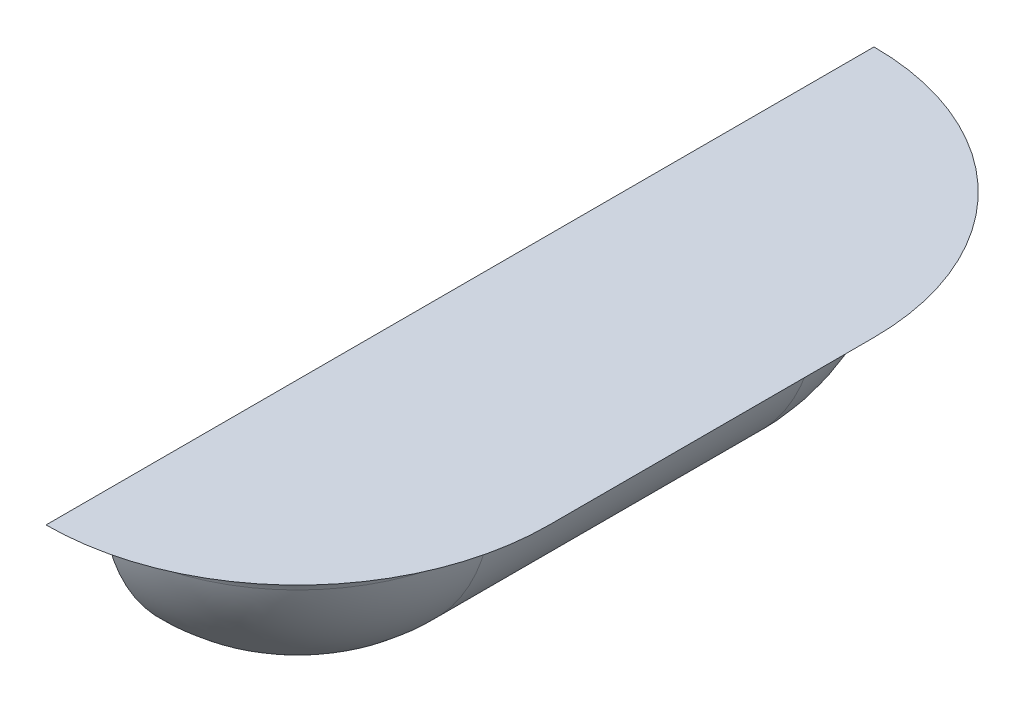
ISO-10303-21;
HEADER;
FILE_DESCRIPTION(('STEP AP214'),'2;1');
FILE_NAME('part.step','',(''),(''),'','','');
FILE_SCHEMA(('AUTOMOTIVE_DESIGN { 1 0 10303 214 1 1 1 1 }'));
ENDSEC;
DATA;
#1=APPLICATION_CONTEXT('core data for automotive mechanical design processes');
#2=APPLICATION_PROTOCOL_DEFINITION('international standard','automotive_design',2000,#1);
#3=PRODUCT_CONTEXT('',#1,'mechanical');
#4=PRODUCT('Part','Part','',(#3));
#5=PRODUCT_RELATED_PRODUCT_CATEGORY('part','',(#4));
#6=PRODUCT_DEFINITION_FORMATION('','',#4);
#7=PRODUCT_DEFINITION_CONTEXT('part definition',#1,'design');
#8=PRODUCT_DEFINITION('design','',#6,#7);
#9=PRODUCT_DEFINITION_SHAPE('','',#8);
#10=(LENGTH_UNIT() NAMED_UNIT(*) SI_UNIT(.MILLI.,.METRE.));
#11=(NAMED_UNIT(*) PLANE_ANGLE_UNIT() SI_UNIT($,.RADIAN.));
#12=(NAMED_UNIT(*) SI_UNIT($,.STERADIAN.) SOLID_ANGLE_UNIT());
#13=UNCERTAINTY_MEASURE_WITH_UNIT(LENGTH_MEASURE(1.E-05),#10,'distance_accuracy_value','');
#14=(GEOMETRIC_REPRESENTATION_CONTEXT(3) GLOBAL_UNCERTAINTY_ASSIGNED_CONTEXT((#13)) GLOBAL_UNIT_ASSIGNED_CONTEXT((#10,
#11,#12)) REPRESENTATION_CONTEXT('',''));
#15=CARTESIAN_POINT('',(0.,0.,0.));
#16=DIRECTION('',(0.,0.,1.));
#17=DIRECTION('',(1.,0.,0.));
#18=AXIS2_PLACEMENT_3D('',#15,#16,#17);
#19=CARTESIAN_POINT('',(-3.,0.,5.));
#20=DIRECTION('',(1.,0.,0.));
#21=DIRECTION('',(0.,0.,-1.));
#22=AXIS2_PLACEMENT_3D('',#19,#20,#21);
#23=PLANE('',#22);
#24=DIRECTION('',(0.,0.,-1.));
#25=VECTOR('',#24,1.);
#26=CARTESIAN_POINT('',(-3.,0.,5.));
#27=LINE('',#26,#25);
#28=CARTESIAN_POINT('',(-3.,0.,12.7459666924148));
#29=VERTEX_POINT('',#28);
#30=CARTESIAN_POINT('',(-3.,0.,-12.7459666924148));
#31=VERTEX_POINT('',#30);
#32=EDGE_CURVE('E90',#29,#31,#27,.T.);
#33=ORIENTED_EDGE('',*,*,#32,.T.);
#34=CARTESIAN_POINT('',(-3.,-2.,-12.7459666924148));
#35=DIRECTION('',(1.,0.,0.));
#36=DIRECTION('',(0.,0.,-1.));
#37=AXIS2_PLACEMENT_3D('',#34,#35,#36);
#38=CIRCLE('',#37,2.);
#39=CARTESIAN_POINT('',(-3.00000000000002,-1.5,-10.8094750193111));
#40=VERTEX_POINT('',#39);
#41=EDGE_CURVE('E11',#31,#40,#38,.T.);
#42=ORIENTED_EDGE('',*,*,#41,.T.);
#43=CARTESIAN_POINT('',(-3.,0.,-5.));
#44=DIRECTION('',(-1.,0.,0.));
#45=DIRECTION('',(0.,0.,1.));
#46=AXIS2_PLACEMENT_3D('',#43,#44,#45);
#47=CIRCLE('',#46,6.);
#48=CARTESIAN_POINT('',(-3.,-6.,-5.));
#49=VERTEX_POINT('',#48);
#50=EDGE_CURVE('E123',#40,#49,#47,.T.);
#51=ORIENTED_EDGE('',*,*,#50,.T.);
#52=DIRECTION('',(0.,0.,-1.));
#53=VECTOR('',#52,1.);
#54=CARTESIAN_POINT('',(-3.,-6.,5.));
#55=LINE('',#54,#53);
#56=CARTESIAN_POINT('',(-3.,-6.,5.));
#57=VERTEX_POINT('',#56);
#58=EDGE_CURVE('E119',#57,#49,#55,.T.);
#59=ORIENTED_EDGE('',*,*,#58,.F.);
#60=CARTESIAN_POINT('',(-3.,0.,5.));
#61=DIRECTION('',(-1.,0.,0.));
#62=DIRECTION('',(0.,0.,1.));
#63=AXIS2_PLACEMENT_3D('',#60,#61,#62);
#64=CIRCLE('',#63,6.);
#65=CARTESIAN_POINT('',(-3.00000000000002,-1.5,10.8094750193111));
#66=VERTEX_POINT('',#65);
#67=EDGE_CURVE('E117',#57,#66,#64,.T.);
#68=ORIENTED_EDGE('',*,*,#67,.T.);
#69=CARTESIAN_POINT('',(-3.,-2.,12.7459666924148));
#70=DIRECTION('',(1.,0.,0.));
#71=DIRECTION('',(0.,0.,-1.));
#72=AXIS2_PLACEMENT_3D('',#69,#70,#71);
#73=CIRCLE('',#72,2.);
#74=EDGE_CURVE('E45',#66,#29,#73,.T.);
#75=ORIENTED_EDGE('',*,*,#74,.T.);
#76=EDGE_LOOP('',(#33,#42,#51,#59,#68,#75));
#77=FACE_BOUND('',#76,.T.);
#78=ADVANCED_FACE('F36',(#77),#23,.F.);
#79=CARTESIAN_POINT('',(-3.,0.,5.));
#80=DIRECTION('',(0.,0.,-1.));
#81=DIRECTION('',(-1.,0.,0.));
#82=AXIS2_PLACEMENT_3D('',#79,#80,#81);
#83=CYLINDRICAL_SURFACE('',#82,6.);
#84=CARTESIAN_POINT('',(-3.,0.,-5.));
#85=DIRECTION('',(0.,0.,1.));
#86=DIRECTION('',(1.,0.,0.));
#87=AXIS2_PLACEMENT_3D('',#84,#85,#86);
#88=CIRCLE('',#87,6.);
#89=CARTESIAN_POINT('',(2.80947501931112,-1.5,-5.));
#90=VERTEX_POINT('',#89);
#91=EDGE_CURVE('E122',#49,#90,#88,.T.);
#92=ORIENTED_EDGE('',*,*,#91,.T.);
#93=DIRECTION('',(0.,0.,-1.));
#94=VECTOR('',#93,1.);
#95=CARTESIAN_POINT('',(2.80947501931112,-1.5,5.));
#96=LINE('',#95,#94);
#97=CARTESIAN_POINT('',(2.80947501931112,-1.5,5.));
#98=VERTEX_POINT('',#97);
#99=EDGE_CURVE('E111',#90,#98,#96,.F.);
#100=ORIENTED_EDGE('',*,*,#99,.T.);
#101=CARTESIAN_POINT('',(-3.,0.,5.));
#102=DIRECTION('',(0.,0.,1.));
#103=DIRECTION('',(1.,0.,0.));
#104=AXIS2_PLACEMENT_3D('',#101,#102,#103);
#105=CIRCLE('',#104,6.);
#106=EDGE_CURVE('E125',#57,#98,#105,.T.);
#107=ORIENTED_EDGE('',*,*,#106,.F.);
#108=ORIENTED_EDGE('',*,*,#58,.T.);
#109=EDGE_LOOP('',(#92,#100,#107,#108));
#110=FACE_BOUND('',#109,.T.);
#111=ADVANCED_FACE('F131',(#110),#83,.T.);
#112=CARTESIAN_POINT('',(-3.,0.,5.));
#113=DIRECTION('',(0.,1.,0.));
#114=DIRECTION('',(0.,0.,-1.));
#115=AXIS2_PLACEMENT_3D('',#112,#113,#114);
#116=SPHERICAL_SURFACE('',#115,6.);
#117=ORIENTED_EDGE('',*,*,#106,.T.);
#118=CARTESIAN_POINT('',(-3.,-1.5,5.));
#119=DIRECTION('',(0.,1.,0.));
#120=DIRECTION('',(0.,0.,1.));
#121=AXIS2_PLACEMENT_3D('',#118,#119,#120);
#122=CIRCLE('',#121,5.80947501931112);
#123=EDGE_CURVE('E94',#98,#66,#122,.F.);
#124=ORIENTED_EDGE('',*,*,#123,.T.);
#125=ORIENTED_EDGE('',*,*,#67,.F.);
#126=EDGE_LOOP('',(#117,#124,#125));
#127=FACE_BOUND('',#126,.T.);
#128=ADVANCED_FACE('F132',(#127),#116,.T.);
#129=CARTESIAN_POINT('',(-3.,0.,-5.));
#130=DIRECTION('',(0.,-1.,0.));
#131=DIRECTION('',(0.,0.,-1.));
#132=AXIS2_PLACEMENT_3D('',#129,#130,#131);
#133=SPHERICAL_SURFACE('',#132,6.);
#134=ORIENTED_EDGE('',*,*,#50,.F.);
#135=CARTESIAN_POINT('',(-3.,-1.5,-5.));
#136=DIRECTION('',(0.,1.,0.));
#137=DIRECTION('',(0.,0.,1.));
#138=AXIS2_PLACEMENT_3D('',#135,#136,#137);
#139=CIRCLE('',#138,5.80947501931112);
#140=EDGE_CURVE('E58',#40,#90,#139,.F.);
#141=ORIENTED_EDGE('',*,*,#140,.T.);
#142=ORIENTED_EDGE('',*,*,#91,.F.);
#143=EDGE_LOOP('',(#134,#141,#142));
#144=FACE_BOUND('',#143,.T.);
#145=ADVANCED_FACE('F134',(#144),#133,.T.);
#146=CARTESIAN_POINT('',(-3.,-2.,-5.));
#147=DIRECTION('',(0.,1.,0.));
#148=DIRECTION('',(0.,0.,1.));
#149=AXIS2_PLACEMENT_3D('',#146,#147,#148);
#150=TOROIDAL_SURFACE('',#149,7.74596669241483,2.);
#151=ORIENTED_EDGE('',*,*,#41,.F.);
#152=CARTESIAN_POINT('',(-3.,0.,-5.));
#153=DIRECTION('',(0.,1.,0.));
#154=DIRECTION('',(0.,0.,1.));
#155=AXIS2_PLACEMENT_3D('',#152,#153,#154);
#156=CIRCLE('',#155,7.74596669241483);
#157=CARTESIAN_POINT('',(4.74596669241483,0.,-5.));
#158=VERTEX_POINT('',#157);
#159=EDGE_CURVE('E105',#158,#31,#156,.T.);
#160=ORIENTED_EDGE('',*,*,#159,.F.);
#161=CARTESIAN_POINT('',(4.74596669241483,-2.,-5.));
#162=DIRECTION('',(0.,0.,-1.));
#163=DIRECTION('',(-1.,0.,0.));
#164=AXIS2_PLACEMENT_3D('',#161,#162,#163);
#165=CIRCLE('',#164,2.);
#166=EDGE_CURVE('E40',#90,#158,#165,.T.);
#167=ORIENTED_EDGE('',*,*,#166,.F.);
#168=ORIENTED_EDGE('',*,*,#140,.F.);
#169=EDGE_LOOP('',(#151,#160,#167,#168));
#170=FACE_BOUND('',#169,.T.);
#171=ADVANCED_FACE('F38',(#170),#150,.F.);
#172=CARTESIAN_POINT('',(4.74596669241483,-2.,5.));
#173=DIRECTION('',(0.,0.,-1.));
#174=DIRECTION('',(-1.,0.,0.));
#175=AXIS2_PLACEMENT_3D('',#172,#173,#174);
#176=CYLINDRICAL_SURFACE('',#175,2.);
#177=ORIENTED_EDGE('',*,*,#166,.T.);
#178=DIRECTION('',(0.,0.,1.));
#179=VECTOR('',#178,1.);
#180=CARTESIAN_POINT('',(4.74596669241483,0.,-5.));
#181=LINE('',#180,#179);
#182=CARTESIAN_POINT('',(4.74596669241483,0.,5.));
#183=VERTEX_POINT('',#182);
#184=EDGE_CURVE('E88',#183,#158,#181,.F.);
#185=ORIENTED_EDGE('',*,*,#184,.F.);
#186=CARTESIAN_POINT('',(4.74596669241483,-2.,5.));
#187=DIRECTION('',(0.,0.,-1.));
#188=DIRECTION('',(-1.,0.,0.));
#189=AXIS2_PLACEMENT_3D('',#186,#187,#188);
#190=CIRCLE('',#189,2.);
#191=EDGE_CURVE('E98',#98,#183,#190,.T.);
#192=ORIENTED_EDGE('',*,*,#191,.F.);
#193=ORIENTED_EDGE('',*,*,#99,.F.);
#194=EDGE_LOOP('',(#177,#185,#192,#193));
#195=FACE_BOUND('',#194,.T.);
#196=ADVANCED_FACE('F103',(#195),#176,.F.);
#197=CARTESIAN_POINT('',(-3.,-2.,5.));
#198=DIRECTION('',(0.,1.,0.));
#199=DIRECTION('',(0.,0.,1.));
#200=AXIS2_PLACEMENT_3D('',#197,#198,#199);
#201=TOROIDAL_SURFACE('',#200,7.74596669241483,2.);
#202=ORIENTED_EDGE('',*,*,#74,.F.);
#203=ORIENTED_EDGE('',*,*,#123,.F.);
#204=ORIENTED_EDGE('',*,*,#191,.T.);
#205=CARTESIAN_POINT('',(-3.,0.,5.));
#206=DIRECTION('',(0.,1.,0.));
#207=DIRECTION('',(0.,0.,1.));
#208=AXIS2_PLACEMENT_3D('',#205,#206,#207);
#209=CIRCLE('',#208,7.74596669241483);
#210=EDGE_CURVE('E84',#29,#183,#209,.T.);
#211=ORIENTED_EDGE('',*,*,#210,.F.);
#212=EDGE_LOOP('',(#202,#203,#204,#211));
#213=FACE_BOUND('',#212,.T.);
#214=ADVANCED_FACE('F99',(#213),#201,.F.);
#215=CARTESIAN_POINT('',(15.,0.,-25.));
#216=DIRECTION('',(0.,-1.,0.));
#217=DIRECTION('',(0.,0.,-1.));
#218=AXIS2_PLACEMENT_3D('',#215,#216,#217);
#219=PLANE('',#218);
#220=ORIENTED_EDGE('',*,*,#210,.T.);
#221=ORIENTED_EDGE('',*,*,#184,.T.);
#222=ORIENTED_EDGE('',*,*,#159,.T.);
#223=ORIENTED_EDGE('',*,*,#32,.F.);
#224=EDGE_LOOP('',(#220,#221,#222,#223));
#225=FACE_BOUND('',#224,.T.);
#226=ADVANCED_FACE('F86',(#225),#219,.F.);
#227=CLOSED_SHELL('',(#78,#111,#128,#145,#171,#196,#214,#226));
#228=MANIFOLD_SOLID_BREP('B2',#227);
#229=ADVANCED_BREP_SHAPE_REPRESENTATION('',(#18,#228),#14);
#230=SHAPE_DEFINITION_REPRESENTATION(#9,#229);
ENDSEC;
END-ISO-10303-21;
